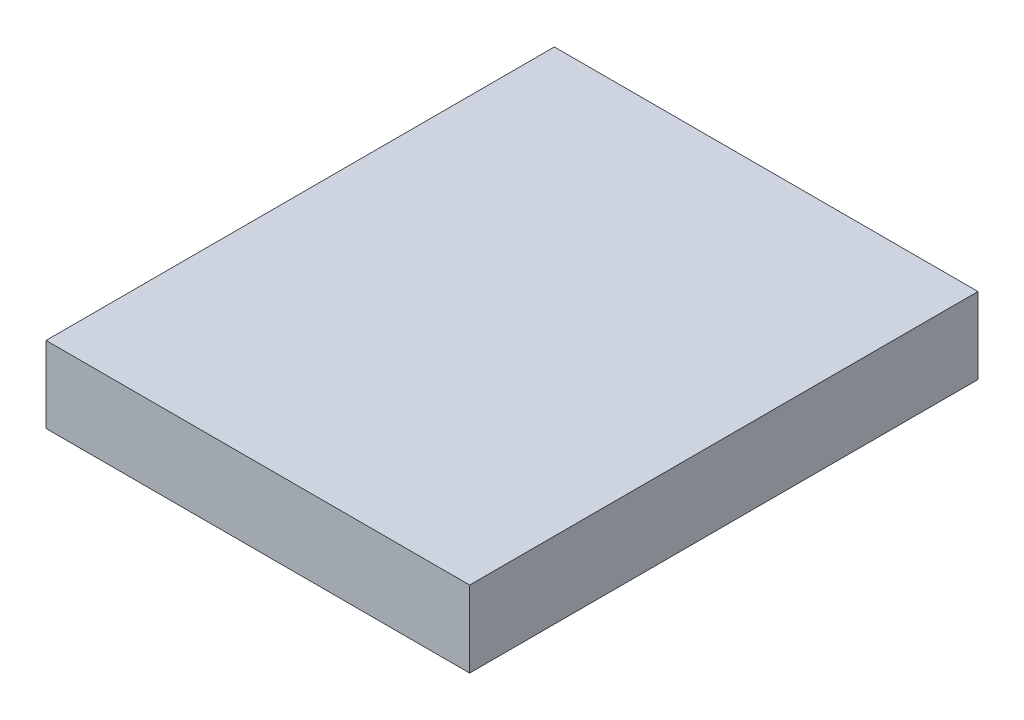
ISO-10303-21;
HEADER;
FILE_DESCRIPTION(('STEP AP214'),'2;1');
FILE_NAME('part.step','',(''),(''),'','','');
FILE_SCHEMA(('AUTOMOTIVE_DESIGN { 1 0 10303 214 1 1 1 1 }'));
ENDSEC;
DATA;
#1=APPLICATION_CONTEXT('core data for automotive mechanical design processes');
#2=APPLICATION_PROTOCOL_DEFINITION('international standard','automotive_design',2000,#1);
#3=PRODUCT_CONTEXT('',#1,'mechanical');
#4=PRODUCT('Part','Part','',(#3));
#5=PRODUCT_RELATED_PRODUCT_CATEGORY('part','',(#4));
#6=PRODUCT_DEFINITION_FORMATION('','',#4);
#7=PRODUCT_DEFINITION_CONTEXT('part definition',#1,'design');
#8=PRODUCT_DEFINITION('design','',#6,#7);
#9=PRODUCT_DEFINITION_SHAPE('','',#8);
#10=(LENGTH_UNIT() NAMED_UNIT(*) SI_UNIT(.MILLI.,.METRE.));
#11=(NAMED_UNIT(*) PLANE_ANGLE_UNIT() SI_UNIT($,.RADIAN.));
#12=(NAMED_UNIT(*) SI_UNIT($,.STERADIAN.) SOLID_ANGLE_UNIT());
#13=UNCERTAINTY_MEASURE_WITH_UNIT(LENGTH_MEASURE(1.E-05),#10,'distance_accuracy_value','');
#14=(GEOMETRIC_REPRESENTATION_CONTEXT(3) GLOBAL_UNCERTAINTY_ASSIGNED_CONTEXT((#13)) GLOBAL_UNIT_ASSIGNED_CONTEXT((#10,
#11,#12)) REPRESENTATION_CONTEXT('',''));
#15=CARTESIAN_POINT('',(0.,0.,0.));
#16=DIRECTION('',(0.,0.,1.));
#17=DIRECTION('',(1.,0.,0.));
#18=AXIS2_PLACEMENT_3D('',#15,#16,#17);
#19=CARTESIAN_POINT('',(12.5,4.5,15.));
#20=DIRECTION('',(-1.,0.,0.));
#21=DIRECTION('',(0.,0.,1.));
#22=AXIS2_PLACEMENT_3D('',#19,#20,#21);
#23=PLANE('',#22);
#24=DIRECTION('',(0.,0.,-1.));
#25=VECTOR('',#24,1.);
#26=CARTESIAN_POINT('',(12.5,0.,15.));
#27=LINE('',#26,#25);
#28=CARTESIAN_POINT('',(12.5,0.,15.));
#29=VERTEX_POINT('',#28);
#30=CARTESIAN_POINT('',(12.5,0.,-15.));
#31=VERTEX_POINT('',#30);
#32=EDGE_CURVE('E110',#29,#31,#27,.T.);
#33=ORIENTED_EDGE('',*,*,#32,.T.);
#34=DIRECTION('',(0.,-1.,0.));
#35=VECTOR('',#34,1.);
#36=CARTESIAN_POINT('',(12.5,4.5,-15.));
#37=LINE('',#36,#35);
#38=CARTESIAN_POINT('',(12.5,4.5,-15.));
#39=VERTEX_POINT('',#38);
#40=EDGE_CURVE('E11',#39,#31,#37,.T.);
#41=ORIENTED_EDGE('',*,*,#40,.F.);
#42=DIRECTION('',(0.,0.,-1.));
#43=VECTOR('',#42,1.);
#44=CARTESIAN_POINT('',(12.5,4.5,15.));
#45=LINE('',#44,#43);
#46=CARTESIAN_POINT('',(12.5,4.5,15.));
#47=VERTEX_POINT('',#46);
#48=EDGE_CURVE('E94',#47,#39,#45,.T.);
#49=ORIENTED_EDGE('',*,*,#48,.F.);
#50=DIRECTION('',(0.,-1.,0.));
#51=VECTOR('',#50,1.);
#52=CARTESIAN_POINT('',(12.5,4.5,15.));
#53=LINE('',#52,#51);
#54=EDGE_CURVE('E106',#47,#29,#53,.T.);
#55=ORIENTED_EDGE('',*,*,#54,.T.);
#56=EDGE_LOOP('',(#33,#41,#49,#55));
#57=FACE_BOUND('',#56,.T.);
#58=ADVANCED_FACE('F42',(#57),#23,.F.);
#59=CARTESIAN_POINT('',(-12.5,4.5,-15.));
#60=DIRECTION('',(0.,0.,1.));
#61=DIRECTION('',(1.,0.,0.));
#62=AXIS2_PLACEMENT_3D('',#59,#60,#61);
#63=PLANE('',#62);
#64=DIRECTION('',(-1.,0.,0.));
#65=VECTOR('',#64,1.);
#66=CARTESIAN_POINT('',(-12.5,0.,-15.));
#67=LINE('',#66,#65);
#68=CARTESIAN_POINT('',(-12.5,0.,-15.));
#69=VERTEX_POINT('',#68);
#70=EDGE_CURVE('E99',#31,#69,#67,.T.);
#71=ORIENTED_EDGE('',*,*,#70,.T.);
#72=DIRECTION('',(0.,-1.,0.));
#73=VECTOR('',#72,1.);
#74=CARTESIAN_POINT('',(-12.5,4.5,-15.));
#75=LINE('',#74,#73);
#76=CARTESIAN_POINT('',(-12.5,4.5,-15.));
#77=VERTEX_POINT('',#76);
#78=EDGE_CURVE('E51',#77,#69,#75,.T.);
#79=ORIENTED_EDGE('',*,*,#78,.F.);
#80=DIRECTION('',(-1.,0.,0.));
#81=VECTOR('',#80,1.);
#82=CARTESIAN_POINT('',(-12.5,4.5,-15.));
#83=LINE('',#82,#81);
#84=EDGE_CURVE('E89',#39,#77,#83,.T.);
#85=ORIENTED_EDGE('',*,*,#84,.F.);
#86=ORIENTED_EDGE('',*,*,#40,.T.);
#87=EDGE_LOOP('',(#71,#79,#85,#86));
#88=FACE_BOUND('',#87,.T.);
#89=ADVANCED_FACE('F98',(#88),#63,.F.);
#90=CARTESIAN_POINT('',(-12.5,4.5,15.));
#91=DIRECTION('',(1.,0.,0.));
#92=DIRECTION('',(0.,0.,-1.));
#93=AXIS2_PLACEMENT_3D('',#90,#91,#92);
#94=PLANE('',#93);
#95=DIRECTION('',(0.,0.,1.));
#96=VECTOR('',#95,1.);
#97=CARTESIAN_POINT('',(-12.5,0.,15.));
#98=LINE('',#97,#96);
#99=CARTESIAN_POINT('',(-12.5,0.,15.));
#100=VERTEX_POINT('',#99);
#101=EDGE_CURVE('E76',#69,#100,#98,.T.);
#102=ORIENTED_EDGE('',*,*,#101,.T.);
#103=DIRECTION('',(0.,-1.,0.));
#104=VECTOR('',#103,1.);
#105=CARTESIAN_POINT('',(-12.5,4.5,15.));
#106=LINE('',#105,#104);
#107=CARTESIAN_POINT('',(-12.5,4.5,15.));
#108=VERTEX_POINT('',#107);
#109=EDGE_CURVE('E101',#108,#100,#106,.T.);
#110=ORIENTED_EDGE('',*,*,#109,.F.);
#111=DIRECTION('',(0.,0.,1.));
#112=VECTOR('',#111,1.);
#113=CARTESIAN_POINT('',(-12.5,4.5,15.));
#114=LINE('',#113,#112);
#115=EDGE_CURVE('E92',#77,#108,#114,.T.);
#116=ORIENTED_EDGE('',*,*,#115,.F.);
#117=ORIENTED_EDGE('',*,*,#78,.T.);
#118=EDGE_LOOP('',(#102,#110,#116,#117));
#119=FACE_BOUND('',#118,.T.);
#120=ADVANCED_FACE('F102',(#119),#94,.F.);
#121=CARTESIAN_POINT('',(-12.5,4.5,15.));
#122=DIRECTION('',(0.,0.,-1.));
#123=DIRECTION('',(-1.,0.,0.));
#124=AXIS2_PLACEMENT_3D('',#121,#122,#123);
#125=PLANE('',#124);
#126=DIRECTION('',(1.,0.,0.));
#127=VECTOR('',#126,1.);
#128=CARTESIAN_POINT('',(-12.5,0.,15.));
#129=LINE('',#128,#127);
#130=EDGE_CURVE('E82',#100,#29,#129,.T.);
#131=ORIENTED_EDGE('',*,*,#130,.T.);
#132=ORIENTED_EDGE('',*,*,#54,.F.);
#133=DIRECTION('',(1.,0.,0.));
#134=VECTOR('',#133,1.);
#135=CARTESIAN_POINT('',(-12.5,4.5,15.));
#136=LINE('',#135,#134);
#137=EDGE_CURVE('E59',#108,#47,#136,.T.);
#138=ORIENTED_EDGE('',*,*,#137,.F.);
#139=ORIENTED_EDGE('',*,*,#109,.T.);
#140=EDGE_LOOP('',(#131,#132,#138,#139));
#141=FACE_BOUND('',#140,.T.);
#142=ADVANCED_FACE('F123',(#141),#125,.F.);
#143=CARTESIAN_POINT('',(0.,4.5,0.));
#144=DIRECTION('',(0.,-1.,0.));
#145=DIRECTION('',(0.,0.,-1.));
#146=AXIS2_PLACEMENT_3D('',#143,#144,#145);
#147=PLANE('',#146);
#148=ORIENTED_EDGE('',*,*,#48,.T.);
#149=ORIENTED_EDGE('',*,*,#84,.T.);
#150=ORIENTED_EDGE('',*,*,#115,.T.);
#151=ORIENTED_EDGE('',*,*,#137,.T.);
#152=EDGE_LOOP('',(#148,#149,#150,#151));
#153=FACE_BOUND('',#152,.T.);
#154=ADVANCED_FACE('F90',(#153),#147,.F.);
#155=CARTESIAN_POINT('',(0.,0.,0.));
#156=DIRECTION('',(0.,-1.,0.));
#157=DIRECTION('',(0.,0.,-1.));
#158=AXIS2_PLACEMENT_3D('',#155,#156,#157);
#159=PLANE('',#158);
#160=ORIENTED_EDGE('',*,*,#32,.F.);
#161=ORIENTED_EDGE('',*,*,#130,.F.);
#162=ORIENTED_EDGE('',*,*,#101,.F.);
#163=ORIENTED_EDGE('',*,*,#70,.F.);
#164=EDGE_LOOP('',(#160,#161,#162,#163));
#165=FACE_BOUND('',#164,.T.);
#166=ADVANCED_FACE('F126',(#165),#159,.T.);
#167=CLOSED_SHELL('',(#58,#89,#120,#142,#154,#166));
#168=MANIFOLD_SOLID_BREP('B2',#167);
#169=ADVANCED_BREP_SHAPE_REPRESENTATION('',(#18,#168),#14);
#170=SHAPE_DEFINITION_REPRESENTATION(#9,#169);
ENDSEC;
END-ISO-10303-21;
